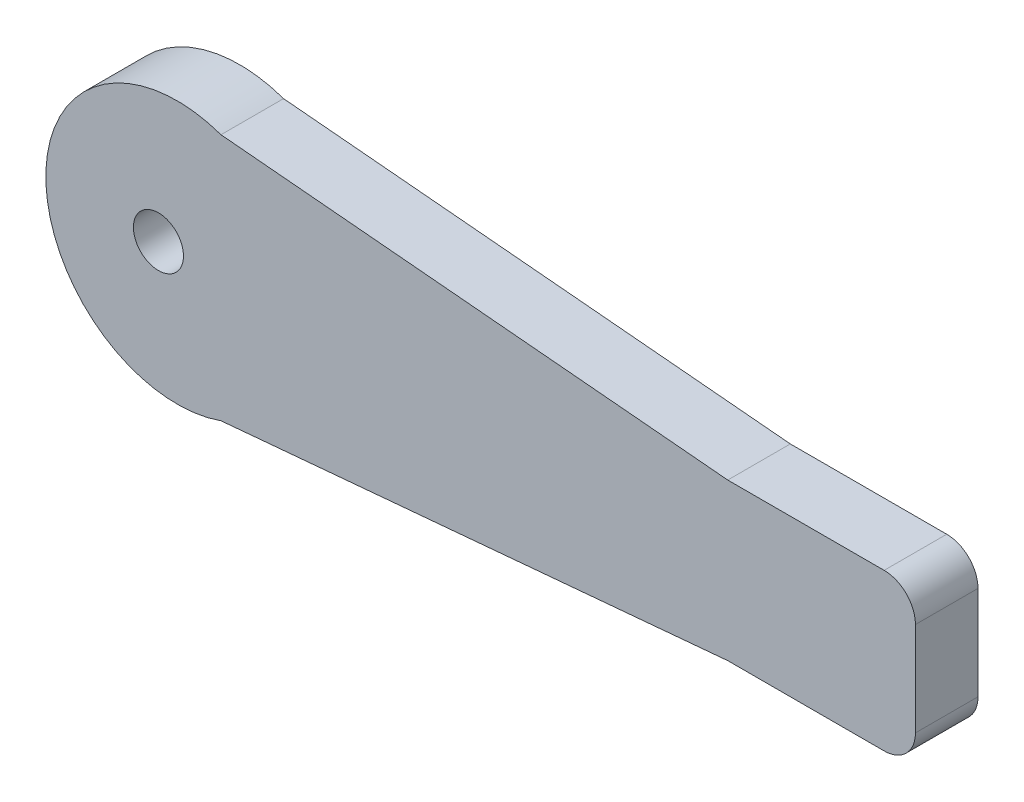
ISO-10303-21;
HEADER;
FILE_DESCRIPTION(('STEP AP214'),'2;1');
FILE_NAME('part.step','',(''),(''),'','','');
FILE_SCHEMA(('AUTOMOTIVE_DESIGN { 1 0 10303 214 1 1 1 1 }'));
ENDSEC;
DATA;
#1=APPLICATION_CONTEXT('core data for automotive mechanical design processes');
#2=APPLICATION_PROTOCOL_DEFINITION('international standard','automotive_design',2000,#1);
#3=PRODUCT_CONTEXT('',#1,'mechanical');
#4=PRODUCT('Part','Part','',(#3));
#5=PRODUCT_RELATED_PRODUCT_CATEGORY('part','',(#4));
#6=PRODUCT_DEFINITION_FORMATION('','',#4);
#7=PRODUCT_DEFINITION_CONTEXT('part definition',#1,'design');
#8=PRODUCT_DEFINITION('design','',#6,#7);
#9=PRODUCT_DEFINITION_SHAPE('','',#8);
#10=(LENGTH_UNIT() NAMED_UNIT(*) SI_UNIT(.MILLI.,.METRE.));
#11=(NAMED_UNIT(*) PLANE_ANGLE_UNIT() SI_UNIT($,.RADIAN.));
#12=(NAMED_UNIT(*) SI_UNIT($,.STERADIAN.) SOLID_ANGLE_UNIT());
#13=UNCERTAINTY_MEASURE_WITH_UNIT(LENGTH_MEASURE(1.E-05),#10,'distance_accuracy_value','');
#14=(GEOMETRIC_REPRESENTATION_CONTEXT(3) GLOBAL_UNCERTAINTY_ASSIGNED_CONTEXT((#13)) GLOBAL_UNIT_ASSIGNED_CONTEXT((#10,
#11,#12)) REPRESENTATION_CONTEXT('',''));
#15=CARTESIAN_POINT('',(0.,0.,0.));
#16=DIRECTION('',(0.,0.,1.));
#17=DIRECTION('',(1.,0.,0.));
#18=AXIS2_PLACEMENT_3D('',#15,#16,#17);
#19=CARTESIAN_POINT('',(1.4354709145618,15.930032250909,10.));
#20=DIRECTION('',(0.0897473489992364,0.995964564303173,0.));
#21=DIRECTION('',(-0.995964564303173,0.0897473489992364,0.));
#22=AXIS2_PLACEMENT_3D('',#19,#20,#21);
#23=PLANE('',#22);
#24=DIRECTION('',(0.995964564303173,-0.0897473489992364,0.));
#25=VECTOR('',#24,1.);
#26=CARTESIAN_POINT('',(1.4354709145618,15.930032250909,0.));
#27=LINE('',#26,#25);
#28=CARTESIAN_POINT('',(-41.5,19.7989898732233,0.));
#29=VERTEX_POINT('',#28);
#30=CARTESIAN_POINT('',(39.5,12.5,0.));
#31=VERTEX_POINT('',#30);
#32=EDGE_CURVE('E113',#29,#31,#27,.T.);
#33=ORIENTED_EDGE('',*,*,#32,.F.);
#34=DIRECTION('',(0.,0.,-1.));
#35=VECTOR('',#34,1.);
#36=CARTESIAN_POINT('',(-41.5,19.7989898732233,10.));
#37=LINE('',#36,#35);
#38=CARTESIAN_POINT('',(-41.5,19.7989898732233,10.));
#39=VERTEX_POINT('',#38);
#40=EDGE_CURVE('E107',#39,#29,#37,.T.);
#41=ORIENTED_EDGE('',*,*,#40,.F.);
#42=DIRECTION('',(0.995964564303173,-0.0897473489992364,0.));
#43=VECTOR('',#42,1.);
#44=CARTESIAN_POINT('',(1.4354709145618,15.930032250909,10.));
#45=LINE('',#44,#43);
#46=CARTESIAN_POINT('',(39.5,12.5,10.));
#47=VERTEX_POINT('',#46);
#48=EDGE_CURVE('E111',#39,#47,#45,.T.);
#49=ORIENTED_EDGE('',*,*,#48,.T.);
#50=DIRECTION('',(0.,0.,-1.));
#51=VECTOR('',#50,1.);
#52=CARTESIAN_POINT('',(39.5,12.5,10.));
#53=LINE('',#52,#51);
#54=EDGE_CURVE('E144',#47,#31,#53,.T.);
#55=ORIENTED_EDGE('',*,*,#54,.T.);
#56=EDGE_LOOP('',(#33,#41,#49,#55));
#57=FACE_BOUND('',#56,.T.);
#58=ADVANCED_FACE('F39',(#57),#23,.T.);
#59=CARTESIAN_POINT('',(-48.5,0.,10.));
#60=DIRECTION('',(0.,0.,-1.));
#61=DIRECTION('',(-1.,0.,0.));
#62=AXIS2_PLACEMENT_3D('',#59,#60,#61);
#63=CYLINDRICAL_SURFACE('',#62,21.);
#64=CARTESIAN_POINT('',(-48.5,0.,0.));
#65=DIRECTION('',(0.,0.,1.));
#66=DIRECTION('',(1.,0.,0.));
#67=AXIS2_PLACEMENT_3D('',#64,#65,#66);
#68=CIRCLE('',#67,21.);
#69=CARTESIAN_POINT('',(-41.5,-19.7989898732233,0.));
#70=VERTEX_POINT('',#69);
#71=EDGE_CURVE('E146',#29,#70,#68,.T.);
#72=ORIENTED_EDGE('',*,*,#71,.T.);
#73=DIRECTION('',(0.,0.,-1.));
#74=VECTOR('',#73,1.);
#75=CARTESIAN_POINT('',(-41.5,-19.7989898732233,10.));
#76=LINE('',#75,#74);
#77=CARTESIAN_POINT('',(-41.5,-19.7989898732233,10.));
#78=VERTEX_POINT('',#77);
#79=EDGE_CURVE('E118',#78,#70,#76,.T.);
#80=ORIENTED_EDGE('',*,*,#79,.F.);
#81=CARTESIAN_POINT('',(-48.5,0.,10.));
#82=DIRECTION('',(0.,0.,1.));
#83=DIRECTION('',(1.,0.,0.));
#84=AXIS2_PLACEMENT_3D('',#81,#82,#83);
#85=CIRCLE('',#84,21.);
#86=EDGE_CURVE('E121',#39,#78,#85,.T.);
#87=ORIENTED_EDGE('',*,*,#86,.F.);
#88=ORIENTED_EDGE('',*,*,#40,.T.);
#89=EDGE_LOOP('',(#72,#80,#87,#88));
#90=FACE_BOUND('',#89,.T.);
#91=ADVANCED_FACE('F122',(#90),#63,.T.);
#92=CARTESIAN_POINT('',(1.4354709145618,-15.930032250909,10.));
#93=DIRECTION('',(0.0897473489992364,-0.995964564303173,0.));
#94=DIRECTION('',(0.995964564303173,0.0897473489992364,0.));
#95=AXIS2_PLACEMENT_3D('',#92,#93,#94);
#96=PLANE('',#95);
#97=DIRECTION('',(-0.995964564303173,-0.0897473489992364,0.));
#98=VECTOR('',#97,1.);
#99=CARTESIAN_POINT('',(1.4354709145618,-15.930032250909,0.));
#100=LINE('',#99,#98);
#101=CARTESIAN_POINT('',(39.5,-12.5,0.));
#102=VERTEX_POINT('',#101);
#103=EDGE_CURVE('E148',#102,#70,#100,.T.);
#104=ORIENTED_EDGE('',*,*,#103,.F.);
#105=DIRECTION('',(0.,0.,-1.));
#106=VECTOR('',#105,1.);
#107=CARTESIAN_POINT('',(39.5,-12.5,10.));
#108=LINE('',#107,#106);
#109=CARTESIAN_POINT('',(39.5,-12.5,10.));
#110=VERTEX_POINT('',#109);
#111=EDGE_CURVE('E156',#110,#102,#108,.T.);
#112=ORIENTED_EDGE('',*,*,#111,.F.);
#113=DIRECTION('',(-0.995964564303173,-0.0897473489992364,0.));
#114=VECTOR('',#113,1.);
#115=CARTESIAN_POINT('',(1.4354709145618,-15.930032250909,10.));
#116=LINE('',#115,#114);
#117=EDGE_CURVE('E125',#110,#78,#116,.T.);
#118=ORIENTED_EDGE('',*,*,#117,.T.);
#119=ORIENTED_EDGE('',*,*,#79,.T.);
#120=EDGE_LOOP('',(#104,#112,#118,#119));
#121=FACE_BOUND('',#120,.T.);
#122=ADVANCED_FACE('F184',(#121),#96,.T.);
#123=CARTESIAN_POINT('',(0.,-12.5,10.));
#124=DIRECTION('',(0.,-1.,0.));
#125=DIRECTION('',(1.,0.,0.));
#126=AXIS2_PLACEMENT_3D('',#123,#124,#125);
#127=PLANE('',#126);
#128=DIRECTION('',(-1.,0.,0.));
#129=VECTOR('',#128,1.);
#130=CARTESIAN_POINT('',(0.,-12.5,0.));
#131=LINE('',#130,#129);
#132=CARTESIAN_POINT('',(64.5,-12.5,0.));
#133=VERTEX_POINT('',#132);
#134=EDGE_CURVE('E151',#133,#102,#131,.T.);
#135=ORIENTED_EDGE('',*,*,#134,.F.);
#136=DIRECTION('',(0.,0.,-1.));
#137=VECTOR('',#136,1.);
#138=CARTESIAN_POINT('',(64.5,-12.5,10.));
#139=LINE('',#138,#137);
#140=CARTESIAN_POINT('',(64.5,-12.5,10.));
#141=VERTEX_POINT('',#140);
#142=EDGE_CURVE('E63',#133,#141,#139,.F.);
#143=ORIENTED_EDGE('',*,*,#142,.T.);
#144=DIRECTION('',(-1.,0.,0.));
#145=VECTOR('',#144,1.);
#146=CARTESIAN_POINT('',(0.,-12.5,10.));
#147=LINE('',#146,#145);
#148=EDGE_CURVE('E138',#141,#110,#147,.T.);
#149=ORIENTED_EDGE('',*,*,#148,.T.);
#150=ORIENTED_EDGE('',*,*,#111,.T.);
#151=EDGE_LOOP('',(#135,#143,#149,#150));
#152=FACE_BOUND('',#151,.T.);
#153=ADVANCED_FACE('F180',(#152),#127,.T.);
#154=CARTESIAN_POINT('',(69.5,0.,10.));
#155=DIRECTION('',(1.,0.,0.));
#156=DIRECTION('',(0.,0.,-1.));
#157=AXIS2_PLACEMENT_3D('',#154,#155,#156);
#158=PLANE('',#157);
#159=DIRECTION('',(0.,-1.,0.));
#160=VECTOR('',#159,1.);
#161=CARTESIAN_POINT('',(69.5,0.,10.));
#162=LINE('',#161,#160);
#163=CARTESIAN_POINT('',(69.5,7.5,10.));
#164=VERTEX_POINT('',#163);
#165=CARTESIAN_POINT('',(69.5,-7.5,10.));
#166=VERTEX_POINT('',#165);
#167=EDGE_CURVE('E140',#164,#166,#162,.T.);
#168=ORIENTED_EDGE('',*,*,#167,.T.);
#169=DIRECTION('',(0.,0.,-1.));
#170=VECTOR('',#169,1.);
#171=CARTESIAN_POINT('',(69.5,-7.5,10.));
#172=LINE('',#171,#170);
#173=CARTESIAN_POINT('',(69.5,-7.5,0.));
#174=VERTEX_POINT('',#173);
#175=EDGE_CURVE('E161',#166,#174,#172,.T.);
#176=ORIENTED_EDGE('',*,*,#175,.T.);
#177=DIRECTION('',(0.,-1.,0.));
#178=VECTOR('',#177,1.);
#179=CARTESIAN_POINT('',(69.5,0.,0.));
#180=LINE('',#179,#178);
#181=CARTESIAN_POINT('',(69.5,7.5,0.));
#182=VERTEX_POINT('',#181);
#183=EDGE_CURVE('E132',#182,#174,#180,.T.);
#184=ORIENTED_EDGE('',*,*,#183,.F.);
#185=DIRECTION('',(0.,0.,-1.));
#186=VECTOR('',#185,1.);
#187=CARTESIAN_POINT('',(69.5,7.5,10.));
#188=LINE('',#187,#186);
#189=EDGE_CURVE('E117',#182,#164,#188,.F.);
#190=ORIENTED_EDGE('',*,*,#189,.T.);
#191=EDGE_LOOP('',(#168,#176,#184,#190));
#192=FACE_BOUND('',#191,.T.);
#193=ADVANCED_FACE('F174',(#192),#158,.T.);
#194=CARTESIAN_POINT('',(0.,12.5,10.));
#195=DIRECTION('',(0.,-1.,0.));
#196=DIRECTION('',(1.,0.,0.));
#197=AXIS2_PLACEMENT_3D('',#194,#195,#196);
#198=PLANE('',#197);
#199=DIRECTION('',(-1.,0.,0.));
#200=VECTOR('',#199,1.);
#201=CARTESIAN_POINT('',(0.,12.5,10.));
#202=LINE('',#201,#200);
#203=CARTESIAN_POINT('',(64.5,12.5,10.));
#204=VERTEX_POINT('',#203);
#205=EDGE_CURVE('E128',#204,#47,#202,.T.);
#206=ORIENTED_EDGE('',*,*,#205,.F.);
#207=DIRECTION('',(0.,0.,-1.));
#208=VECTOR('',#207,1.);
#209=CARTESIAN_POINT('',(64.5,12.5,0.));
#210=LINE('',#209,#208);
#211=CARTESIAN_POINT('',(64.5,12.5,0.));
#212=VERTEX_POINT('',#211);
#213=EDGE_CURVE('E11',#204,#212,#210,.T.);
#214=ORIENTED_EDGE('',*,*,#213,.T.);
#215=DIRECTION('',(-1.,0.,0.));
#216=VECTOR('',#215,1.);
#217=CARTESIAN_POINT('',(0.,12.5,0.));
#218=LINE('',#217,#216);
#219=EDGE_CURVE('E130',#212,#31,#218,.T.);
#220=ORIENTED_EDGE('',*,*,#219,.T.);
#221=ORIENTED_EDGE('',*,*,#54,.F.);
#222=EDGE_LOOP('',(#206,#214,#220,#221));
#223=FACE_BOUND('',#222,.T.);
#224=ADVANCED_FACE('F187',(#223),#198,.F.);
#225=CARTESIAN_POINT('',(0.,0.,10.));
#226=DIRECTION('',(0.,0.,1.));
#227=DIRECTION('',(1.,0.,0.));
#228=AXIS2_PLACEMENT_3D('',#225,#226,#227);
#229=PLANE('',#228);
#230=CARTESIAN_POINT('',(-51.5,0.,10.));
#231=DIRECTION('',(0.,0.,1.));
#232=DIRECTION('',(1.,0.,0.));
#233=AXIS2_PLACEMENT_3D('',#230,#231,#232);
#234=CIRCLE('',#233,4.00000000000001);
#235=CARTESIAN_POINT('',(-47.5,0.,10.));
#236=VERTEX_POINT('',#235);
#237=EDGE_CURVE('E135',#236,#236,#234,.T.);
#238=ORIENTED_EDGE('',*,*,#237,.F.);
#239=EDGE_LOOP('',(#238));
#240=FACE_BOUND('',#239,.T.);
#241=ORIENTED_EDGE('',*,*,#148,.F.);
#242=CARTESIAN_POINT('',(64.5,-7.5,10.));
#243=DIRECTION('',(0.,0.,1.));
#244=DIRECTION('',(1.,0.,0.));
#245=AXIS2_PLACEMENT_3D('',#242,#243,#244);
#246=CIRCLE('',#245,5.);
#247=EDGE_CURVE('E48',#141,#166,#246,.T.);
#248=ORIENTED_EDGE('',*,*,#247,.T.);
#249=ORIENTED_EDGE('',*,*,#167,.F.);
#250=CARTESIAN_POINT('',(64.5,7.5,10.));
#251=DIRECTION('',(0.,0.,1.));
#252=DIRECTION('',(1.,0.,0.));
#253=AXIS2_PLACEMENT_3D('',#250,#251,#252);
#254=CIRCLE('',#253,5.);
#255=EDGE_CURVE('E55',#164,#204,#254,.T.);
#256=ORIENTED_EDGE('',*,*,#255,.T.);
#257=ORIENTED_EDGE('',*,*,#205,.T.);
#258=ORIENTED_EDGE('',*,*,#48,.F.);
#259=ORIENTED_EDGE('',*,*,#86,.T.);
#260=ORIENTED_EDGE('',*,*,#117,.F.);
#261=EDGE_LOOP('',(#241,#248,#249,#256,#257,#258,#259,#260));
#262=FACE_BOUND('',#261,.T.);
#263=ADVANCED_FACE('F127',(#240,#262),#229,.T.);
#264=CARTESIAN_POINT('',(0.,0.,0.));
#265=DIRECTION('',(0.,0.,1.));
#266=DIRECTION('',(1.,0.,0.));
#267=AXIS2_PLACEMENT_3D('',#264,#265,#266);
#268=PLANE('',#267);
#269=CARTESIAN_POINT('',(-51.5,0.,0.));
#270=DIRECTION('',(0.,0.,1.));
#271=DIRECTION('',(1.,0.,0.));
#272=AXIS2_PLACEMENT_3D('',#269,#270,#271);
#273=CIRCLE('',#272,4.00000000000001);
#274=CARTESIAN_POINT('',(-47.5,0.,0.));
#275=VERTEX_POINT('',#274);
#276=EDGE_CURVE('E43',#275,#275,#273,.T.);
#277=ORIENTED_EDGE('',*,*,#276,.T.);
#278=EDGE_LOOP('',(#277));
#279=FACE_BOUND('',#278,.T.);
#280=ORIENTED_EDGE('',*,*,#183,.T.);
#281=CARTESIAN_POINT('',(64.5,-7.5,0.));
#282=DIRECTION('',(0.,0.,1.));
#283=DIRECTION('',(1.,0.,0.));
#284=AXIS2_PLACEMENT_3D('',#281,#282,#283);
#285=CIRCLE('',#284,5.);
#286=EDGE_CURVE('E166',#174,#133,#285,.F.);
#287=ORIENTED_EDGE('',*,*,#286,.T.);
#288=ORIENTED_EDGE('',*,*,#134,.T.);
#289=ORIENTED_EDGE('',*,*,#103,.T.);
#290=ORIENTED_EDGE('',*,*,#71,.F.);
#291=ORIENTED_EDGE('',*,*,#32,.T.);
#292=ORIENTED_EDGE('',*,*,#219,.F.);
#293=CARTESIAN_POINT('',(64.5,7.5,0.));
#294=DIRECTION('',(0.,0.,1.));
#295=DIRECTION('',(1.,0.,0.));
#296=AXIS2_PLACEMENT_3D('',#293,#294,#295);
#297=CIRCLE('',#296,5.);
#298=EDGE_CURVE('E164',#212,#182,#297,.F.);
#299=ORIENTED_EDGE('',*,*,#298,.T.);
#300=EDGE_LOOP('',(#280,#287,#288,#289,#290,#291,#292,#299));
#301=FACE_BOUND('',#300,.T.);
#302=ADVANCED_FACE('F179',(#279,#301),#268,.F.);
#303=CARTESIAN_POINT('',(64.5,-7.5,10.));
#304=DIRECTION('',(0.,0.,-1.));
#305=DIRECTION('',(-1.,0.,0.));
#306=AXIS2_PLACEMENT_3D('',#303,#304,#305);
#307=CYLINDRICAL_SURFACE('',#306,5.);
#308=ORIENTED_EDGE('',*,*,#247,.F.);
#309=ORIENTED_EDGE('',*,*,#142,.F.);
#310=ORIENTED_EDGE('',*,*,#286,.F.);
#311=ORIENTED_EDGE('',*,*,#175,.F.);
#312=EDGE_LOOP('',(#308,#309,#310,#311));
#313=FACE_BOUND('',#312,.T.);
#314=ADVANCED_FACE('F177',(#313),#307,.T.);
#315=CARTESIAN_POINT('',(64.5,7.5,10.));
#316=DIRECTION('',(0.,0.,1.));
#317=DIRECTION('',(1.,0.,0.));
#318=AXIS2_PLACEMENT_3D('',#315,#316,#317);
#319=CYLINDRICAL_SURFACE('',#318,5.);
#320=ORIENTED_EDGE('',*,*,#255,.F.);
#321=ORIENTED_EDGE('',*,*,#189,.F.);
#322=ORIENTED_EDGE('',*,*,#298,.F.);
#323=ORIENTED_EDGE('',*,*,#213,.F.);
#324=EDGE_LOOP('',(#320,#321,#322,#323));
#325=FACE_BOUND('',#324,.T.);
#326=ADVANCED_FACE('F41',(#325),#319,.T.);
#327=CARTESIAN_POINT('',(-51.5,0.,-4.));
#328=DIRECTION('',(0.,0.,1.));
#329=DIRECTION('',(1.,0.,0.));
#330=AXIS2_PLACEMENT_3D('',#327,#328,#329);
#331=CYLINDRICAL_SURFACE('',#330,4.00000000000001);
#332=ORIENTED_EDGE('',*,*,#237,.T.);
#333=EDGE_LOOP('',(#332));
#334=FACE_BOUND('',#333,.T.);
#335=ORIENTED_EDGE('',*,*,#276,.F.);
#336=EDGE_LOOP('',(#335));
#337=FACE_BOUND('',#336,.T.);
#338=ADVANCED_FACE('F191',(#334,#337),#331,.F.);
#339=CLOSED_SHELL('',(#58,#91,#122,#153,#193,#224,#263,#302,#314,#326,#338));
#340=MANIFOLD_SOLID_BREP('B2',#339);
#341=ADVANCED_BREP_SHAPE_REPRESENTATION('',(#18,#340),#14);
#342=SHAPE_DEFINITION_REPRESENTATION(#9,#341);
ENDSEC;
END-ISO-10303-21;
